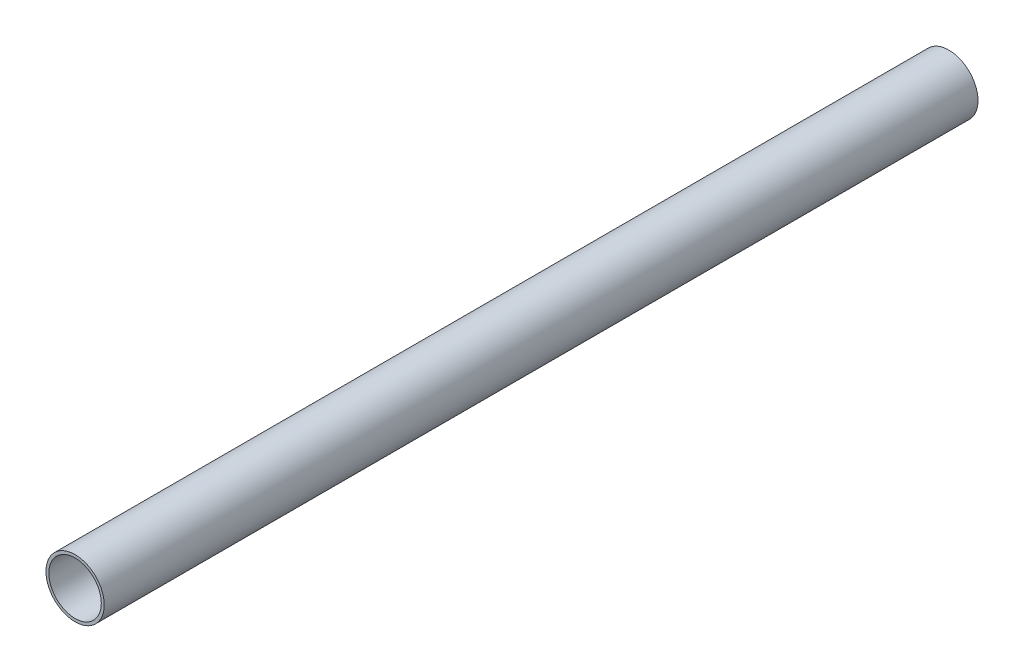
ISO-10303-21;
HEADER;
FILE_DESCRIPTION(('STEP AP214'),'2;1');
FILE_NAME('part.step','',(''),(''),'','','');
FILE_SCHEMA(('AUTOMOTIVE_DESIGN { 1 0 10303 214 1 1 1 1 }'));
ENDSEC;
DATA;
#1=APPLICATION_CONTEXT('core data for automotive mechanical design processes');
#2=APPLICATION_PROTOCOL_DEFINITION('international standard','automotive_design',2000,#1);
#3=PRODUCT_CONTEXT('',#1,'mechanical');
#4=PRODUCT('Part','Part','',(#3));
#5=PRODUCT_RELATED_PRODUCT_CATEGORY('part','',(#4));
#6=PRODUCT_DEFINITION_FORMATION('','',#4);
#7=PRODUCT_DEFINITION_CONTEXT('part definition',#1,'design');
#8=PRODUCT_DEFINITION('design','',#6,#7);
#9=PRODUCT_DEFINITION_SHAPE('','',#8);
#10=(LENGTH_UNIT() NAMED_UNIT(*) SI_UNIT(.MILLI.,.METRE.));
#11=(NAMED_UNIT(*) PLANE_ANGLE_UNIT() SI_UNIT($,.RADIAN.));
#12=(NAMED_UNIT(*) SI_UNIT($,.STERADIAN.) SOLID_ANGLE_UNIT());
#13=UNCERTAINTY_MEASURE_WITH_UNIT(LENGTH_MEASURE(1.E-05),#10,'distance_accuracy_value','');
#14=(GEOMETRIC_REPRESENTATION_CONTEXT(3) GLOBAL_UNCERTAINTY_ASSIGNED_CONTEXT((#13)) GLOBAL_UNIT_ASSIGNED_CONTEXT((#10,
#11,#12)) REPRESENTATION_CONTEXT('',''));
#15=CARTESIAN_POINT('',(0.,0.,0.));
#16=DIRECTION('',(0.,0.,1.));
#17=DIRECTION('',(1.,0.,0.));
#18=AXIS2_PLACEMENT_3D('',#15,#16,#17);
#19=CARTESIAN_POINT('',(0.,0.,300.));
#20=DIRECTION('',(0.,0.,1.));
#21=DIRECTION('',(1.,0.,0.));
#22=AXIS2_PLACEMENT_3D('',#19,#20,#21);
#23=PLANE('',#22);
#24=CARTESIAN_POINT('',(0.,0.,300.));
#25=DIRECTION('',(0.,0.,1.));
#26=DIRECTION('',(1.,0.,0.));
#27=AXIS2_PLACEMENT_3D('',#24,#25,#26);
#28=CIRCLE('',#27,10.);
#29=CARTESIAN_POINT('',(10.,0.,300.));
#30=VERTEX_POINT('',#29);
#31=EDGE_CURVE('E10',#30,#30,#28,.T.);
#32=ORIENTED_EDGE('',*,*,#31,.T.);
#33=EDGE_LOOP('',(#32));
#34=FACE_BOUND('',#33,.T.);
#35=CARTESIAN_POINT('',(0.,0.,300.));
#36=DIRECTION('',(0.,0.,1.));
#37=DIRECTION('',(1.,0.,0.));
#38=AXIS2_PLACEMENT_3D('',#35,#36,#37);
#39=CIRCLE('',#38,9.);
#40=CARTESIAN_POINT('',(9.,0.,300.));
#41=VERTEX_POINT('',#40);
#42=EDGE_CURVE('E43',#41,#41,#39,.T.);
#43=ORIENTED_EDGE('',*,*,#42,.F.);
#44=EDGE_LOOP('',(#43));
#45=FACE_BOUND('',#44,.T.);
#46=ADVANCED_FACE('F32',(#34,#45),#23,.T.);
#47=CARTESIAN_POINT('',(0.,0.,0.));
#48=DIRECTION('',(0.,0.,1.));
#49=DIRECTION('',(1.,0.,0.));
#50=AXIS2_PLACEMENT_3D('',#47,#48,#49);
#51=PLANE('',#50);
#52=CARTESIAN_POINT('',(0.,0.,0.));
#53=DIRECTION('',(0.,0.,1.));
#54=DIRECTION('',(1.,0.,0.));
#55=AXIS2_PLACEMENT_3D('',#52,#53,#54);
#56=CIRCLE('',#55,10.);
#57=CARTESIAN_POINT('',(10.,0.,0.));
#58=VERTEX_POINT('',#57);
#59=EDGE_CURVE('E36',#58,#58,#56,.T.);
#60=ORIENTED_EDGE('',*,*,#59,.F.);
#61=EDGE_LOOP('',(#60));
#62=FACE_BOUND('',#61,.T.);
#63=CARTESIAN_POINT('',(0.,0.,0.));
#64=DIRECTION('',(0.,0.,1.));
#65=DIRECTION('',(1.,0.,0.));
#66=AXIS2_PLACEMENT_3D('',#63,#64,#65);
#67=CIRCLE('',#66,9.);
#68=CARTESIAN_POINT('',(9.,0.,0.));
#69=VERTEX_POINT('',#68);
#70=EDGE_CURVE('E45',#69,#69,#67,.T.);
#71=ORIENTED_EDGE('',*,*,#70,.T.);
#72=EDGE_LOOP('',(#71));
#73=FACE_BOUND('',#72,.T.);
#74=ADVANCED_FACE('F55',(#62,#73),#51,.F.);
#75=CARTESIAN_POINT('',(0.,0.,300.));
#76=DIRECTION('',(0.,0.,-1.));
#77=DIRECTION('',(-1.,0.,0.));
#78=AXIS2_PLACEMENT_3D('',#75,#76,#77);
#79=CYLINDRICAL_SURFACE('',#78,10.);
#80=ORIENTED_EDGE('',*,*,#31,.F.);
#81=EDGE_LOOP('',(#80));
#82=FACE_BOUND('',#81,.T.);
#83=ORIENTED_EDGE('',*,*,#59,.T.);
#84=EDGE_LOOP('',(#83));
#85=FACE_BOUND('',#84,.T.);
#86=ADVANCED_FACE('F34',(#82,#85),#79,.T.);
#87=CARTESIAN_POINT('',(0.,0.,300.));
#88=DIRECTION('',(0.,0.,-1.));
#89=DIRECTION('',(-1.,0.,0.));
#90=AXIS2_PLACEMENT_3D('',#87,#88,#89);
#91=CYLINDRICAL_SURFACE('',#90,9.);
#92=ORIENTED_EDGE('',*,*,#42,.T.);
#93=EDGE_LOOP('',(#92));
#94=FACE_BOUND('',#93,.T.);
#95=ORIENTED_EDGE('',*,*,#70,.F.);
#96=EDGE_LOOP('',(#95));
#97=FACE_BOUND('',#96,.T.);
#98=ADVANCED_FACE('F51',(#94,#97),#91,.F.);
#99=CLOSED_SHELL('',(#46,#74,#86,#98));
#100=MANIFOLD_SOLID_BREP('B2',#99);
#101=ADVANCED_BREP_SHAPE_REPRESENTATION('',(#18,#100),#14);
#102=SHAPE_DEFINITION_REPRESENTATION(#9,#101);
ENDSEC;
END-ISO-10303-21;
